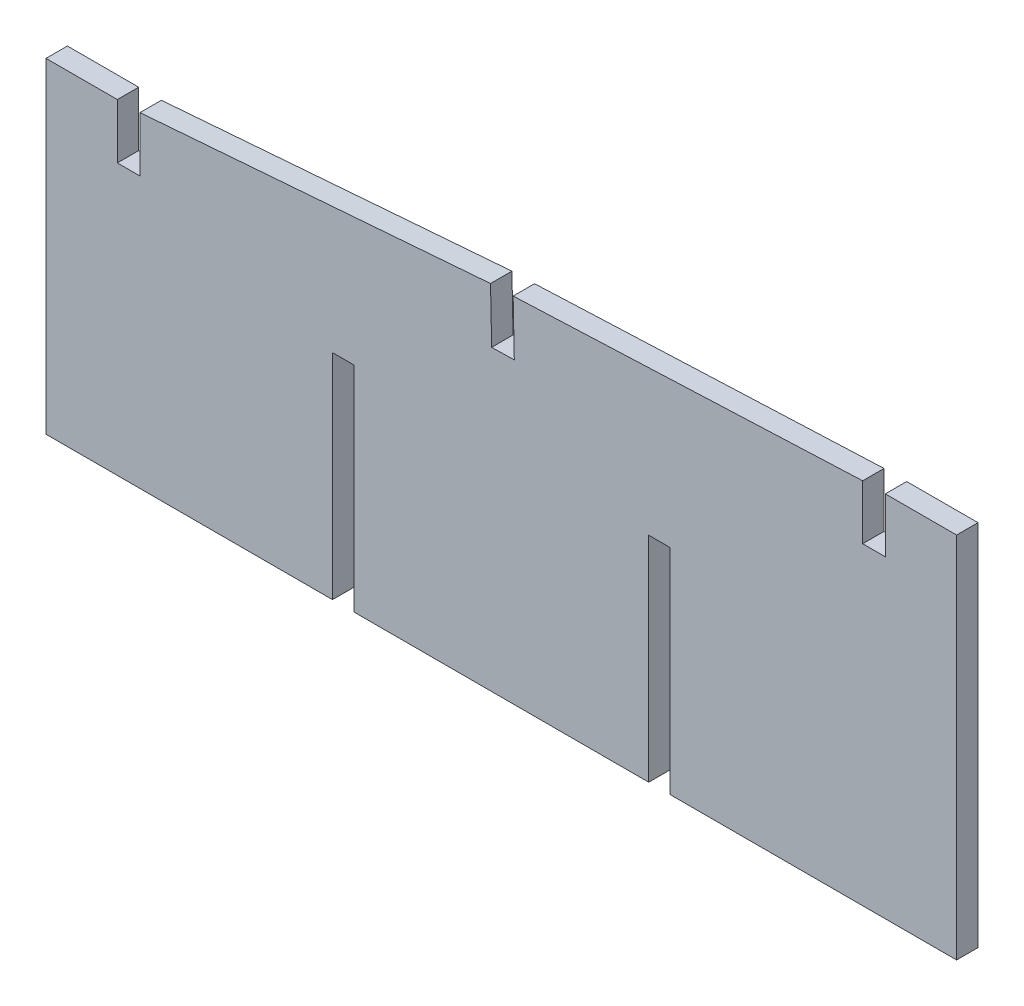
ISO-10303-21;
HEADER;
FILE_DESCRIPTION(('STEP AP214'),'2;1');
FILE_NAME('part.step','',(''),(''),'','','');
FILE_SCHEMA(('AUTOMOTIVE_DESIGN { 1 0 10303 214 1 1 1 1 }'));
ENDSEC;
DATA;
#1=APPLICATION_CONTEXT('core data for automotive mechanical design processes');
#2=APPLICATION_PROTOCOL_DEFINITION('international standard','automotive_design',2000,#1);
#3=PRODUCT_CONTEXT('',#1,'mechanical');
#4=PRODUCT('Part','Part','',(#3));
#5=PRODUCT_RELATED_PRODUCT_CATEGORY('part','',(#4));
#6=PRODUCT_DEFINITION_FORMATION('','',#4);
#7=PRODUCT_DEFINITION_CONTEXT('part definition',#1,'design');
#8=PRODUCT_DEFINITION('design','',#6,#7);
#9=PRODUCT_DEFINITION_SHAPE('','',#8);
#10=(LENGTH_UNIT() NAMED_UNIT(*) SI_UNIT(.MILLI.,.METRE.));
#11=(NAMED_UNIT(*) PLANE_ANGLE_UNIT() SI_UNIT($,.RADIAN.));
#12=(NAMED_UNIT(*) SI_UNIT($,.STERADIAN.) SOLID_ANGLE_UNIT());
#13=UNCERTAINTY_MEASURE_WITH_UNIT(LENGTH_MEASURE(1.E-05),#10,'distance_accuracy_value','');
#14=(GEOMETRIC_REPRESENTATION_CONTEXT(3) GLOBAL_UNCERTAINTY_ASSIGNED_CONTEXT((#13)) GLOBAL_UNIT_ASSIGNED_CONTEXT((#10,
#11,#12)) REPRESENTATION_CONTEXT('',''));
#15=CARTESIAN_POINT('',(0.,0.,0.));
#16=DIRECTION('',(0.,0.,1.));
#17=DIRECTION('',(1.,0.,0.));
#18=AXIS2_PLACEMENT_3D('',#15,#16,#17);
#19=CARTESIAN_POINT('',(374.396000000001,60.4052755232168,-423.));
#20=DIRECTION('',(-1.,0.,0.));
#21=DIRECTION('',(0.,0.,1.));
#22=AXIS2_PLACEMENT_3D('',#19,#20,#21);
#23=PLANE('',#22);
#24=DIRECTION('',(0.,-1.,0.));
#25=VECTOR('',#24,1.);
#26=CARTESIAN_POINT('',(374.396000000001,60.4052755232168,-420.));
#27=LINE('',#26,#25);
#28=CARTESIAN_POINT('',(374.396000000001,68.0484523892603,-420.));
#29=VERTEX_POINT('',#28);
#30=CARTESIAN_POINT('',(374.396000000001,60.4052755232168,-420.));
#31=VERTEX_POINT('',#30);
#32=EDGE_CURVE('E226',#29,#31,#27,.T.);
#33=ORIENTED_EDGE('',*,*,#32,.F.);
#34=DIRECTION('',(0.,0.,1.));
#35=VECTOR('',#34,1.);
#36=CARTESIAN_POINT('',(374.396000000001,68.0484523892603,-423.));
#37=LINE('',#36,#35);
#38=CARTESIAN_POINT('',(374.396000000001,68.0484523892603,-423.));
#39=VERTEX_POINT('',#38);
#40=EDGE_CURVE('E11',#39,#29,#37,.T.);
#41=ORIENTED_EDGE('',*,*,#40,.F.);
#42=DIRECTION('',(0.,-1.,0.));
#43=VECTOR('',#42,1.);
#44=CARTESIAN_POINT('',(374.396000000001,60.4052755232168,-423.));
#45=LINE('',#44,#43);
#46=CARTESIAN_POINT('',(374.396000000001,60.4052755232168,-423.));
#47=VERTEX_POINT('',#46);
#48=EDGE_CURVE('E294',#39,#47,#45,.T.);
#49=ORIENTED_EDGE('',*,*,#48,.T.);
#50=DIRECTION('',(0.,0.,1.));
#51=VECTOR('',#50,1.);
#52=CARTESIAN_POINT('',(374.396000000001,60.4052755232168,-423.));
#53=LINE('',#52,#51);
#54=EDGE_CURVE('E36',#47,#31,#53,.T.);
#55=ORIENTED_EDGE('',*,*,#54,.T.);
#56=EDGE_LOOP('',(#33,#41,#49,#55));
#57=FACE_BOUND('',#56,.T.);
#58=ADVANCED_FACE('F33',(#57),#23,.T.);
#59=CARTESIAN_POINT('',(384.396000000001,68.0484523892603,-423.));
#60=DIRECTION('',(0.,1.,0.));
#61=DIRECTION('',(-1.,0.,0.));
#62=AXIS2_PLACEMENT_3D('',#59,#60,#61);
#63=PLANE('',#62);
#64=DIRECTION('',(-1.,0.,0.));
#65=VECTOR('',#64,1.);
#66=CARTESIAN_POINT('',(384.396000000001,68.0484523892603,-420.));
#67=LINE('',#66,#65);
#68=CARTESIAN_POINT('',(384.396000000001,68.0484523892603,-420.));
#69=VERTEX_POINT('',#68);
#70=EDGE_CURVE('E292',#69,#29,#67,.T.);
#71=ORIENTED_EDGE('',*,*,#70,.F.);
#72=DIRECTION('',(0.,0.,1.));
#73=VECTOR('',#72,1.);
#74=CARTESIAN_POINT('',(384.396000000001,68.0484523892603,-423.));
#75=LINE('',#74,#73);
#76=CARTESIAN_POINT('',(384.396000000001,68.0484523892603,-423.));
#77=VERTEX_POINT('',#76);
#78=EDGE_CURVE('E42',#77,#69,#75,.T.);
#79=ORIENTED_EDGE('',*,*,#78,.F.);
#80=DIRECTION('',(-1.,0.,0.));
#81=VECTOR('',#80,1.);
#82=CARTESIAN_POINT('',(384.396000000001,68.0484523892603,-423.));
#83=LINE('',#82,#81);
#84=EDGE_CURVE('E216',#77,#39,#83,.T.);
#85=ORIENTED_EDGE('',*,*,#84,.T.);
#86=ORIENTED_EDGE('',*,*,#40,.T.);
#87=EDGE_LOOP('',(#71,#79,#85,#86));
#88=FACE_BOUND('',#87,.T.);
#89=ADVANCED_FACE('F338',(#88),#63,.T.);
#90=CARTESIAN_POINT('',(384.396000000001,16.4388254453726,-423.));
#91=DIRECTION('',(1.,0.,0.));
#92=DIRECTION('',(0.,0.,-1.));
#93=AXIS2_PLACEMENT_3D('',#90,#91,#92);
#94=PLANE('',#93);
#95=DIRECTION('',(0.,1.,0.));
#96=VECTOR('',#95,1.);
#97=CARTESIAN_POINT('',(384.396000000001,16.4388254453726,-420.));
#98=LINE('',#97,#96);
#99=CARTESIAN_POINT('',(384.396000000001,16.4388254453726,-420.));
#100=VERTEX_POINT('',#99);
#101=EDGE_CURVE('E203',#100,#69,#98,.T.);
#102=ORIENTED_EDGE('',*,*,#101,.F.);
#103=DIRECTION('',(0.,0.,1.));
#104=VECTOR('',#103,1.);
#105=CARTESIAN_POINT('',(384.396000000001,16.4388254453726,-423.));
#106=LINE('',#105,#104);
#107=CARTESIAN_POINT('',(384.396000000001,16.4388254453726,-423.));
#108=VERTEX_POINT('',#107);
#109=EDGE_CURVE('E198',#108,#100,#106,.T.);
#110=ORIENTED_EDGE('',*,*,#109,.F.);
#111=DIRECTION('',(0.,1.,0.));
#112=VECTOR('',#111,1.);
#113=CARTESIAN_POINT('',(384.396000000001,16.4388254453726,-423.));
#114=LINE('',#113,#112);
#115=EDGE_CURVE('E201',#108,#77,#114,.T.);
#116=ORIENTED_EDGE('',*,*,#115,.T.);
#117=ORIENTED_EDGE('',*,*,#78,.T.);
#118=EDGE_LOOP('',(#102,#110,#116,#117));
#119=FACE_BOUND('',#118,.T.);
#120=ADVANCED_FACE('F200',(#119),#94,.T.);
#121=CARTESIAN_POINT('',(344.221,16.4388254453726,-423.));
#122=DIRECTION('',(0.,-1.,0.));
#123=DIRECTION('',(1.,0.,0.));
#124=AXIS2_PLACEMENT_3D('',#121,#122,#123);
#125=PLANE('',#124);
#126=DIRECTION('',(1.,0.,0.));
#127=VECTOR('',#126,1.);
#128=CARTESIAN_POINT('',(344.221,16.4388254453726,-420.));
#129=LINE('',#128,#127);
#130=CARTESIAN_POINT('',(344.221,16.4388254453726,-420.));
#131=VERTEX_POINT('',#130);
#132=EDGE_CURVE('E289',#131,#100,#129,.T.);
#133=ORIENTED_EDGE('',*,*,#132,.F.);
#134=DIRECTION('',(0.,0.,1.));
#135=VECTOR('',#134,1.);
#136=CARTESIAN_POINT('',(344.221,16.4388254453726,-423.));
#137=LINE('',#136,#135);
#138=CARTESIAN_POINT('',(344.221,16.4388254453726,-423.));
#139=VERTEX_POINT('',#138);
#140=EDGE_CURVE('E208',#139,#131,#137,.T.);
#141=ORIENTED_EDGE('',*,*,#140,.F.);
#142=DIRECTION('',(1.,0.,0.));
#143=VECTOR('',#142,1.);
#144=CARTESIAN_POINT('',(344.221,16.4388254453726,-423.));
#145=LINE('',#144,#143);
#146=EDGE_CURVE('E214',#139,#108,#145,.T.);
#147=ORIENTED_EDGE('',*,*,#146,.T.);
#148=ORIENTED_EDGE('',*,*,#109,.T.);
#149=EDGE_LOOP('',(#133,#141,#147,#148));
#150=FACE_BOUND('',#149,.T.);
#151=ADVANCED_FACE('F218',(#150),#125,.T.);
#152=CARTESIAN_POINT('',(344.221,46.4388254453726,-423.));
#153=DIRECTION('',(-1.,0.,0.));
#154=DIRECTION('',(0.,0.,1.));
#155=AXIS2_PLACEMENT_3D('',#152,#153,#154);
#156=PLANE('',#155);
#157=DIRECTION('',(0.,-1.,0.));
#158=VECTOR('',#157,1.);
#159=CARTESIAN_POINT('',(344.221,46.4388254453726,-420.));
#160=LINE('',#159,#158);
#161=CARTESIAN_POINT('',(344.221,46.4388254453726,-420.));
#162=VERTEX_POINT('',#161);
#163=EDGE_CURVE('E286',#162,#131,#160,.T.);
#164=ORIENTED_EDGE('',*,*,#163,.F.);
#165=DIRECTION('',(0.,0.,1.));
#166=VECTOR('',#165,1.);
#167=CARTESIAN_POINT('',(344.221,46.4388254453726,-423.));
#168=LINE('',#167,#166);
#169=CARTESIAN_POINT('',(344.221,46.4388254453726,-423.));
#170=VERTEX_POINT('',#169);
#171=EDGE_CURVE('E298',#170,#162,#168,.T.);
#172=ORIENTED_EDGE('',*,*,#171,.F.);
#173=DIRECTION('',(0.,-1.,0.));
#174=VECTOR('',#173,1.);
#175=CARTESIAN_POINT('',(344.221,46.4388254453726,-423.));
#176=LINE('',#175,#174);
#177=EDGE_CURVE('E219',#170,#139,#176,.T.);
#178=ORIENTED_EDGE('',*,*,#177,.T.);
#179=ORIENTED_EDGE('',*,*,#140,.T.);
#180=EDGE_LOOP('',(#164,#172,#178,#179));
#181=FACE_BOUND('',#180,.T.);
#182=ADVANCED_FACE('F351',(#181),#156,.T.);
#183=CARTESIAN_POINT('',(341.221,46.4388254453726,-423.));
#184=DIRECTION('',(0.,-1.,0.));
#185=DIRECTION('',(0.,0.,-1.));
#186=AXIS2_PLACEMENT_3D('',#183,#184,#185);
#187=PLANE('',#186);
#188=DIRECTION('',(1.,0.,0.));
#189=VECTOR('',#188,1.);
#190=CARTESIAN_POINT('',(341.221,46.4388254453726,-420.));
#191=LINE('',#190,#189);
#192=CARTESIAN_POINT('',(341.221,46.4388254453726,-420.));
#193=VERTEX_POINT('',#192);
#194=EDGE_CURVE('E283',#193,#162,#191,.T.);
#195=ORIENTED_EDGE('',*,*,#194,.F.);
#196=DIRECTION('',(0.,0.,1.));
#197=VECTOR('',#196,1.);
#198=CARTESIAN_POINT('',(341.221,46.4388254453726,-423.));
#199=LINE('',#198,#197);
#200=CARTESIAN_POINT('',(341.221,46.4388254453726,-423.));
#201=VERTEX_POINT('',#200);
#202=EDGE_CURVE('E300',#201,#193,#199,.T.);
#203=ORIENTED_EDGE('',*,*,#202,.F.);
#204=DIRECTION('',(1.,0.,0.));
#205=VECTOR('',#204,1.);
#206=CARTESIAN_POINT('',(341.221,46.4388254453726,-423.));
#207=LINE('',#206,#205);
#208=EDGE_CURVE('E221',#201,#170,#207,.T.);
#209=ORIENTED_EDGE('',*,*,#208,.T.);
#210=ORIENTED_EDGE('',*,*,#171,.T.);
#211=EDGE_LOOP('',(#195,#203,#209,#210));
#212=FACE_BOUND('',#211,.T.);
#213=ADVANCED_FACE('F354',(#212),#187,.T.);
#214=CARTESIAN_POINT('',(341.221,16.4388254453726,-423.));
#215=DIRECTION('',(1.,0.,0.));
#216=DIRECTION('',(0.,0.,-1.));
#217=AXIS2_PLACEMENT_3D('',#214,#215,#216);
#218=PLANE('',#217);
#219=DIRECTION('',(0.,1.,0.));
#220=VECTOR('',#219,1.);
#221=CARTESIAN_POINT('',(341.221,16.4388254453726,-420.));
#222=LINE('',#221,#220);
#223=CARTESIAN_POINT('',(341.221,16.4388254453726,-420.));
#224=VERTEX_POINT('',#223);
#225=EDGE_CURVE('E280',#224,#193,#222,.T.);
#226=ORIENTED_EDGE('',*,*,#225,.F.);
#227=DIRECTION('',(0.,0.,1.));
#228=VECTOR('',#227,1.);
#229=CARTESIAN_POINT('',(341.221,16.4388254453726,-423.));
#230=LINE('',#229,#228);
#231=CARTESIAN_POINT('',(341.221,16.4388254453726,-423.));
#232=VERTEX_POINT('',#231);
#233=EDGE_CURVE('E302',#232,#224,#230,.T.);
#234=ORIENTED_EDGE('',*,*,#233,.F.);
#235=DIRECTION('',(0.,1.,0.));
#236=VECTOR('',#235,1.);
#237=CARTESIAN_POINT('',(341.221,16.4388254453726,-423.));
#238=LINE('',#237,#236);
#239=EDGE_CURVE('E644',#232,#201,#238,.T.);
#240=ORIENTED_EDGE('',*,*,#239,.T.);
#241=ORIENTED_EDGE('',*,*,#202,.T.);
#242=EDGE_LOOP('',(#226,#234,#240,#241));
#243=FACE_BOUND('',#242,.T.);
#244=ADVANCED_FACE('F358',(#243),#218,.T.);
#245=CARTESIAN_POINT('',(299.875,16.4388254453726,-423.));
#246=DIRECTION('',(0.,-1.,0.));
#247=DIRECTION('',(1.,0.,0.));
#248=AXIS2_PLACEMENT_3D('',#245,#246,#247);
#249=PLANE('',#248);
#250=DIRECTION('',(1.,0.,0.));
#251=VECTOR('',#250,1.);
#252=CARTESIAN_POINT('',(299.875,16.4388254453726,-420.));
#253=LINE('',#252,#251);
#254=CARTESIAN_POINT('',(299.875,16.4388254453726,-420.));
#255=VERTEX_POINT('',#254);
#256=EDGE_CURVE('E277',#255,#224,#253,.T.);
#257=ORIENTED_EDGE('',*,*,#256,.F.);
#258=DIRECTION('',(0.,0.,1.));
#259=VECTOR('',#258,1.);
#260=CARTESIAN_POINT('',(299.875,16.4388254453726,-423.));
#261=LINE('',#260,#259);
#262=CARTESIAN_POINT('',(299.875,16.4388254453726,-423.));
#263=VERTEX_POINT('',#262);
#264=EDGE_CURVE('E304',#263,#255,#261,.T.);
#265=ORIENTED_EDGE('',*,*,#264,.F.);
#266=DIRECTION('',(1.,0.,0.));
#267=VECTOR('',#266,1.);
#268=CARTESIAN_POINT('',(299.875,16.4388254453726,-423.));
#269=LINE('',#268,#267);
#270=EDGE_CURVE('E648',#263,#232,#269,.T.);
#271=ORIENTED_EDGE('',*,*,#270,.T.);
#272=ORIENTED_EDGE('',*,*,#233,.T.);
#273=EDGE_LOOP('',(#257,#265,#271,#272));
#274=FACE_BOUND('',#273,.T.);
#275=ADVANCED_FACE('F362',(#274),#249,.T.);
#276=CARTESIAN_POINT('',(299.875,46.4388254453726,-423.));
#277=DIRECTION('',(-1.,0.,0.));
#278=DIRECTION('',(0.,0.,1.));
#279=AXIS2_PLACEMENT_3D('',#276,#277,#278);
#280=PLANE('',#279);
#281=DIRECTION('',(0.,-1.,0.));
#282=VECTOR('',#281,1.);
#283=CARTESIAN_POINT('',(299.875,46.4388254453726,-420.));
#284=LINE('',#283,#282);
#285=CARTESIAN_POINT('',(299.875,46.4388254453726,-420.));
#286=VERTEX_POINT('',#285);
#287=EDGE_CURVE('E274',#286,#255,#284,.T.);
#288=ORIENTED_EDGE('',*,*,#287,.F.);
#289=DIRECTION('',(0.,0.,1.));
#290=VECTOR('',#289,1.);
#291=CARTESIAN_POINT('',(299.875,46.4388254453726,-423.));
#292=LINE('',#291,#290);
#293=CARTESIAN_POINT('',(299.875,46.4388254453726,-423.));
#294=VERTEX_POINT('',#293);
#295=EDGE_CURVE('E306',#294,#286,#292,.T.);
#296=ORIENTED_EDGE('',*,*,#295,.F.);
#297=DIRECTION('',(0.,-1.,0.));
#298=VECTOR('',#297,1.);
#299=CARTESIAN_POINT('',(299.875,46.4388254453726,-423.));
#300=LINE('',#299,#298);
#301=EDGE_CURVE('E637',#294,#263,#300,.T.);
#302=ORIENTED_EDGE('',*,*,#301,.T.);
#303=ORIENTED_EDGE('',*,*,#264,.T.);
#304=EDGE_LOOP('',(#288,#296,#302,#303));
#305=FACE_BOUND('',#304,.T.);
#306=ADVANCED_FACE('F366',(#305),#280,.T.);
#307=CARTESIAN_POINT('',(296.875,46.4388254453726,-423.));
#308=DIRECTION('',(0.,-1.,0.));
#309=DIRECTION('',(0.,0.,-1.));
#310=AXIS2_PLACEMENT_3D('',#307,#308,#309);
#311=PLANE('',#310);
#312=DIRECTION('',(1.,0.,0.));
#313=VECTOR('',#312,1.);
#314=CARTESIAN_POINT('',(296.875,46.4388254453726,-420.));
#315=LINE('',#314,#313);
#316=CARTESIAN_POINT('',(296.875,46.4388254453726,-420.));
#317=VERTEX_POINT('',#316);
#318=EDGE_CURVE('E271',#317,#286,#315,.T.);
#319=ORIENTED_EDGE('',*,*,#318,.F.);
#320=DIRECTION('',(0.,0.,1.));
#321=VECTOR('',#320,1.);
#322=CARTESIAN_POINT('',(296.875,46.4388254453726,-423.));
#323=LINE('',#322,#321);
#324=CARTESIAN_POINT('',(296.875,46.4388254453726,-423.));
#325=VERTEX_POINT('',#324);
#326=EDGE_CURVE('E308',#325,#317,#323,.T.);
#327=ORIENTED_EDGE('',*,*,#326,.F.);
#328=DIRECTION('',(1.,0.,0.));
#329=VECTOR('',#328,1.);
#330=CARTESIAN_POINT('',(296.875,46.4388254453726,-423.));
#331=LINE('',#330,#329);
#332=EDGE_CURVE('E633',#325,#294,#331,.T.);
#333=ORIENTED_EDGE('',*,*,#332,.T.);
#334=ORIENTED_EDGE('',*,*,#295,.T.);
#335=EDGE_LOOP('',(#319,#327,#333,#334));
#336=FACE_BOUND('',#335,.T.);
#337=ADVANCED_FACE('F370',(#336),#311,.T.);
#338=CARTESIAN_POINT('',(296.875,16.4388254453726,-423.));
#339=DIRECTION('',(1.,0.,0.));
#340=DIRECTION('',(0.,0.,-1.));
#341=AXIS2_PLACEMENT_3D('',#338,#339,#340);
#342=PLANE('',#341);
#343=DIRECTION('',(0.,1.,0.));
#344=VECTOR('',#343,1.);
#345=CARTESIAN_POINT('',(296.875,16.4388254453726,-420.));
#346=LINE('',#345,#344);
#347=CARTESIAN_POINT('',(296.875,16.4388254453726,-420.));
#348=VERTEX_POINT('',#347);
#349=EDGE_CURVE('E268',#348,#317,#346,.T.);
#350=ORIENTED_EDGE('',*,*,#349,.F.);
#351=DIRECTION('',(0.,0.,1.));
#352=VECTOR('',#351,1.);
#353=CARTESIAN_POINT('',(296.875,16.4388254453726,-423.));
#354=LINE('',#353,#352);
#355=CARTESIAN_POINT('',(296.875,16.4388254453726,-423.));
#356=VERTEX_POINT('',#355);
#357=EDGE_CURVE('E310',#356,#348,#354,.T.);
#358=ORIENTED_EDGE('',*,*,#357,.F.);
#359=DIRECTION('',(0.,1.,0.));
#360=VECTOR('',#359,1.);
#361=CARTESIAN_POINT('',(296.875,16.4388254453726,-423.));
#362=LINE('',#361,#360);
#363=EDGE_CURVE('E654',#356,#325,#362,.T.);
#364=ORIENTED_EDGE('',*,*,#363,.T.);
#365=ORIENTED_EDGE('',*,*,#326,.T.);
#366=EDGE_LOOP('',(#350,#358,#364,#365));
#367=FACE_BOUND('',#366,.T.);
#368=ADVANCED_FACE('F374',(#367),#342,.T.);
#369=CARTESIAN_POINT('',(256.7,16.4388254453726,-423.));
#370=DIRECTION('',(0.,-1.,0.));
#371=DIRECTION('',(1.,0.,0.));
#372=AXIS2_PLACEMENT_3D('',#369,#370,#371);
#373=PLANE('',#372);
#374=DIRECTION('',(1.,0.,0.));
#375=VECTOR('',#374,1.);
#376=CARTESIAN_POINT('',(256.7,16.4388254453726,-420.));
#377=LINE('',#376,#375);
#378=CARTESIAN_POINT('',(256.7,16.4388254453726,-420.));
#379=VERTEX_POINT('',#378);
#380=EDGE_CURVE('E265',#379,#348,#377,.T.);
#381=ORIENTED_EDGE('',*,*,#380,.F.);
#382=DIRECTION('',(0.,0.,1.));
#383=VECTOR('',#382,1.);
#384=CARTESIAN_POINT('',(256.7,16.4388254453726,-423.));
#385=LINE('',#384,#383);
#386=CARTESIAN_POINT('',(256.7,16.4388254453726,-423.));
#387=VERTEX_POINT('',#386);
#388=EDGE_CURVE('E312',#387,#379,#385,.T.);
#389=ORIENTED_EDGE('',*,*,#388,.F.);
#390=DIRECTION('',(1.,0.,0.));
#391=VECTOR('',#390,1.);
#392=CARTESIAN_POINT('',(256.7,16.4388254453726,-423.));
#393=LINE('',#392,#391);
#394=EDGE_CURVE('E626',#387,#356,#393,.T.);
#395=ORIENTED_EDGE('',*,*,#394,.T.);
#396=ORIENTED_EDGE('',*,*,#357,.T.);
#397=EDGE_LOOP('',(#381,#389,#395,#396));
#398=FACE_BOUND('',#397,.T.);
#399=ADVANCED_FACE('F378',(#398),#373,.T.);
#400=CARTESIAN_POINT('',(256.7,62.0886348852188,-423.));
#401=DIRECTION('',(-1.,0.,0.));
#402=DIRECTION('',(0.,0.,1.));
#403=AXIS2_PLACEMENT_3D('',#400,#401,#402);
#404=PLANE('',#403);
#405=DIRECTION('',(0.,-1.,0.));
#406=VECTOR('',#405,1.);
#407=CARTESIAN_POINT('',(256.7,62.0886348852188,-420.));
#408=LINE('',#407,#406);
#409=CARTESIAN_POINT('',(256.7,62.0886348852188,-420.));
#410=VERTEX_POINT('',#409);
#411=EDGE_CURVE('E262',#410,#379,#408,.T.);
#412=ORIENTED_EDGE('',*,*,#411,.F.);
#413=DIRECTION('',(0.,0.,1.));
#414=VECTOR('',#413,1.);
#415=CARTESIAN_POINT('',(256.7,62.0886348852188,-423.));
#416=LINE('',#415,#414);
#417=CARTESIAN_POINT('',(256.7,62.0886348852188,-423.));
#418=VERTEX_POINT('',#417);
#419=EDGE_CURVE('E314',#418,#410,#416,.T.);
#420=ORIENTED_EDGE('',*,*,#419,.F.);
#421=DIRECTION('',(0.,-1.,0.));
#422=VECTOR('',#421,1.);
#423=CARTESIAN_POINT('',(256.7,62.0886348852188,-423.));
#424=LINE('',#423,#422);
#425=EDGE_CURVE('E622',#418,#387,#424,.T.);
#426=ORIENTED_EDGE('',*,*,#425,.T.);
#427=ORIENTED_EDGE('',*,*,#388,.T.);
#428=EDGE_LOOP('',(#412,#420,#426,#427));
#429=FACE_BOUND('',#428,.T.);
#430=ADVANCED_FACE('F382',(#429),#404,.T.);
#431=CARTESIAN_POINT('',(266.7,62.0886348852188,-423.));
#432=DIRECTION('',(0.,1.,0.));
#433=DIRECTION('',(-1.,0.,0.));
#434=AXIS2_PLACEMENT_3D('',#431,#432,#433);
#435=PLANE('',#434);
#436=DIRECTION('',(-1.,0.,0.));
#437=VECTOR('',#436,1.);
#438=CARTESIAN_POINT('',(266.7,62.0886348852188,-420.));
#439=LINE('',#438,#437);
#440=CARTESIAN_POINT('',(266.7,62.0886348852188,-420.));
#441=VERTEX_POINT('',#440);
#442=EDGE_CURVE('E259',#441,#410,#439,.T.);
#443=ORIENTED_EDGE('',*,*,#442,.F.);
#444=DIRECTION('',(0.,0.,1.));
#445=VECTOR('',#444,1.);
#446=CARTESIAN_POINT('',(266.7,62.0886348852188,-423.));
#447=LINE('',#446,#445);
#448=CARTESIAN_POINT('',(266.7,62.0886348852188,-423.));
#449=VERTEX_POINT('',#448);
#450=EDGE_CURVE('E316',#449,#441,#447,.T.);
#451=ORIENTED_EDGE('',*,*,#450,.F.);
#452=DIRECTION('',(-1.,0.,0.));
#453=VECTOR('',#452,1.);
#454=CARTESIAN_POINT('',(266.7,62.0886348852188,-423.));
#455=LINE('',#454,#453);
#456=EDGE_CURVE('E658',#449,#418,#455,.T.);
#457=ORIENTED_EDGE('',*,*,#456,.T.);
#458=ORIENTED_EDGE('',*,*,#419,.T.);
#459=EDGE_LOOP('',(#443,#451,#457,#458));
#460=FACE_BOUND('',#459,.T.);
#461=ADVANCED_FACE('F386',(#460),#435,.T.);
#462=CARTESIAN_POINT('',(266.7,62.0886348852188,-423.));
#463=DIRECTION('',(1.,0.,0.));
#464=DIRECTION('',(0.,1.,0.));
#465=AXIS2_PLACEMENT_3D('',#462,#463,#464);
#466=PLANE('',#465);
#467=DIRECTION('',(0.,1.,0.));
#468=VECTOR('',#467,1.);
#469=CARTESIAN_POINT('',(266.7,62.0886348852188,-420.));
#470=LINE('',#469,#468);
#471=CARTESIAN_POINT('',(266.7,54.3898094347038,-420.));
#472=VERTEX_POINT('',#471);
#473=EDGE_CURVE('E256',#472,#441,#470,.T.);
#474=ORIENTED_EDGE('',*,*,#473,.F.);
#475=DIRECTION('',(0.,0.,1.));
#476=VECTOR('',#475,1.);
#477=CARTESIAN_POINT('',(266.7,54.3898094347038,-423.));
#478=LINE('',#477,#476);
#479=CARTESIAN_POINT('',(266.7,54.3898094347038,-423.));
#480=VERTEX_POINT('',#479);
#481=EDGE_CURVE('E318',#480,#472,#478,.T.);
#482=ORIENTED_EDGE('',*,*,#481,.F.);
#483=DIRECTION('',(0.,1.,0.));
#484=VECTOR('',#483,1.);
#485=CARTESIAN_POINT('',(266.7,62.0886348852188,-423.));
#486=LINE('',#485,#484);
#487=EDGE_CURVE('E615',#480,#449,#486,.T.);
#488=ORIENTED_EDGE('',*,*,#487,.T.);
#489=ORIENTED_EDGE('',*,*,#450,.T.);
#490=EDGE_LOOP('',(#474,#482,#488,#489));
#491=FACE_BOUND('',#490,.T.);
#492=ADVANCED_FACE('F390',(#491),#466,.T.);
#493=CARTESIAN_POINT('',(266.7,54.3898094347038,-423.));
#494=DIRECTION('',(0.,1.,0.));
#495=DIRECTION('',(0.,0.,1.));
#496=AXIS2_PLACEMENT_3D('',#493,#494,#495);
#497=PLANE('',#496);
#498=DIRECTION('',(-1.,0.,0.));
#499=VECTOR('',#498,1.);
#500=CARTESIAN_POINT('',(266.7,54.3898094347038,-420.));
#501=LINE('',#500,#499);
#502=CARTESIAN_POINT('',(269.875,54.3898094347038,-420.));
#503=VERTEX_POINT('',#502);
#504=EDGE_CURVE('E253',#503,#472,#501,.T.);
#505=ORIENTED_EDGE('',*,*,#504,.F.);
#506=DIRECTION('',(0.,0.,1.));
#507=VECTOR('',#506,1.);
#508=CARTESIAN_POINT('',(269.875,54.3898094347038,-423.));
#509=LINE('',#508,#507);
#510=CARTESIAN_POINT('',(269.875,54.3898094347038,-423.));
#511=VERTEX_POINT('',#510);
#512=EDGE_CURVE('E320',#511,#503,#509,.T.);
#513=ORIENTED_EDGE('',*,*,#512,.F.);
#514=DIRECTION('',(-1.,0.,0.));
#515=VECTOR('',#514,1.);
#516=CARTESIAN_POINT('',(266.7,54.3898094347038,-423.));
#517=LINE('',#516,#515);
#518=EDGE_CURVE('E611',#511,#480,#517,.T.);
#519=ORIENTED_EDGE('',*,*,#518,.T.);
#520=ORIENTED_EDGE('',*,*,#481,.T.);
#521=EDGE_LOOP('',(#505,#513,#519,#520));
#522=FACE_BOUND('',#521,.T.);
#523=ADVANCED_FACE('F394',(#522),#497,.T.);
#524=CARTESIAN_POINT('',(269.875,62.0886341601574,-423.));
#525=DIRECTION('',(-1.,0.,0.));
#526=DIRECTION('',(0.,0.,1.));
#527=AXIS2_PLACEMENT_3D('',#524,#525,#526);
#528=PLANE('',#527);
#529=DIRECTION('',(0.,-1.,0.));
#530=VECTOR('',#529,1.);
#531=CARTESIAN_POINT('',(269.875,62.0886341601574,-420.));
#532=LINE('',#531,#530);
#533=CARTESIAN_POINT('',(269.875,62.0886341601574,-420.));
#534=VERTEX_POINT('',#533);
#535=EDGE_CURVE('E250',#534,#503,#532,.T.);
#536=ORIENTED_EDGE('',*,*,#535,.F.);
#537=DIRECTION('',(0.,0.,1.));
#538=VECTOR('',#537,1.);
#539=CARTESIAN_POINT('',(269.875,62.0886341601574,-423.));
#540=LINE('',#539,#538);
#541=CARTESIAN_POINT('',(269.875,62.0886341601574,-423.));
#542=VERTEX_POINT('',#541);
#543=EDGE_CURVE('E322',#542,#534,#540,.T.);
#544=ORIENTED_EDGE('',*,*,#543,.F.);
#545=DIRECTION('',(0.,-1.,0.));
#546=VECTOR('',#545,1.);
#547=CARTESIAN_POINT('',(269.875,62.0886341601574,-423.));
#548=LINE('',#547,#546);
#549=EDGE_CURVE('E662',#542,#511,#548,.T.);
#550=ORIENTED_EDGE('',*,*,#549,.T.);
#551=ORIENTED_EDGE('',*,*,#512,.T.);
#552=EDGE_LOOP('',(#536,#544,#550,#551));
#553=FACE_BOUND('',#552,.T.);
#554=ADVANCED_FACE('F398',(#553),#528,.T.);
#555=CARTESIAN_POINT('',(319.035485474159,65.9145009944278,-423.));
#556=DIRECTION('',(-0.0775894161566666,0.996985397335622,0.));
#557=DIRECTION('',(-0.996985397335622,-0.0775894161566666,0.));
#558=AXIS2_PLACEMENT_3D('',#555,#556,#557);
#559=PLANE('',#558);
#560=DIRECTION('',(-0.996985397335622,-0.0775894161566666,0.));
#561=VECTOR('',#560,1.);
#562=CARTESIAN_POINT('',(319.035485474159,65.9145009944278,-420.));
#563=LINE('',#562,#561);
#564=CARTESIAN_POINT('',(319.035485474159,65.9145009944278,-420.));
#565=VERTEX_POINT('',#564);
#566=EDGE_CURVE('E247',#565,#534,#563,.T.);
#567=ORIENTED_EDGE('',*,*,#566,.F.);
#568=DIRECTION('',(0.,0.,1.));
#569=VECTOR('',#568,1.);
#570=CARTESIAN_POINT('',(319.035485474159,65.9145009944278,-423.));
#571=LINE('',#570,#569);
#572=CARTESIAN_POINT('',(319.035485474159,65.9145009944278,-423.));
#573=VERTEX_POINT('',#572);
#574=EDGE_CURVE('E324',#573,#565,#571,.T.);
#575=ORIENTED_EDGE('',*,*,#574,.F.);
#576=DIRECTION('',(-0.996985397335622,-0.0775894161566666,0.));
#577=VECTOR('',#576,1.);
#578=CARTESIAN_POINT('',(319.035485474159,65.9145009944278,-423.));
#579=LINE('',#578,#577);
#580=EDGE_CURVE('E604',#573,#542,#579,.T.);
#581=ORIENTED_EDGE('',*,*,#580,.T.);
#582=ORIENTED_EDGE('',*,*,#543,.T.);
#583=EDGE_LOOP('',(#567,#575,#581,#582));
#584=FACE_BOUND('',#583,.T.);
#585=ADVANCED_FACE('F402',(#584),#559,.T.);
#586=CARTESIAN_POINT('',(319.035485474159,65.9145009944278,-423.));
#587=DIRECTION('',(0.999785281478349,0.0207217503907983,0.));
#588=DIRECTION('',(-0.0207217503907983,0.999785281478349,0.));
#589=AXIS2_PLACEMENT_3D('',#586,#587,#588);
#590=PLANE('',#589);
#591=DIRECTION('',(-0.0207217503907983,0.999785281478349,0.));
#592=VECTOR('',#591,1.);
#593=CARTESIAN_POINT('',(319.035485474159,65.9145009944278,-420.));
#594=LINE('',#593,#592);
#595=CARTESIAN_POINT('',(319.194537443408,58.2405441690028,-420.));
#596=VERTEX_POINT('',#595);
#597=EDGE_CURVE('E244',#596,#565,#594,.T.);
#598=ORIENTED_EDGE('',*,*,#597,.F.);
#599=DIRECTION('',(0.,0.,1.));
#600=VECTOR('',#599,1.);
#601=CARTESIAN_POINT('',(319.194537443408,58.2405441690028,-423.));
#602=LINE('',#601,#600);
#603=CARTESIAN_POINT('',(319.194537443408,58.2405441690028,-423.));
#604=VERTEX_POINT('',#603);
#605=EDGE_CURVE('E326',#604,#596,#602,.T.);
#606=ORIENTED_EDGE('',*,*,#605,.F.);
#607=DIRECTION('',(-0.0207217503907983,0.999785281478349,0.));
#608=VECTOR('',#607,1.);
#609=CARTESIAN_POINT('',(319.035485474159,65.9145009944278,-423.));
#610=LINE('',#609,#608);
#611=EDGE_CURVE('E600',#604,#573,#610,.T.);
#612=ORIENTED_EDGE('',*,*,#611,.T.);
#613=ORIENTED_EDGE('',*,*,#574,.T.);
#614=EDGE_LOOP('',(#598,#606,#612,#613));
#615=FACE_BOUND('',#614,.T.);
#616=ADVANCED_FACE('F406',(#615),#590,.T.);
#617=CARTESIAN_POINT('',(319.194537443408,58.2405441690028,-423.));
#618=DIRECTION('',(-0.0206300635458126,0.999787177592359,0.));
#619=DIRECTION('',(-0.999787177592359,-0.0206300635458126,0.));
#620=AXIS2_PLACEMENT_3D('',#617,#618,#619);
#621=PLANE('',#620);
#622=DIRECTION('',(-0.999787177592359,-0.0206300635458126,0.));
#623=VECTOR('',#622,1.);
#624=CARTESIAN_POINT('',(319.194537443408,58.2405441690028,-420.));
#625=LINE('',#624,#623);
#626=CARTESIAN_POINT('',(322.368863108611,58.3060446491609,-420.));
#627=VERTEX_POINT('',#626);
#628=EDGE_CURVE('E241',#627,#596,#625,.T.);
#629=ORIENTED_EDGE('',*,*,#628,.F.);
#630=DIRECTION('',(0.,0.,1.));
#631=VECTOR('',#630,1.);
#632=CARTESIAN_POINT('',(322.368863108611,58.3060446491609,-423.));
#633=LINE('',#632,#631);
#634=CARTESIAN_POINT('',(322.368863108611,58.3060446491609,-423.));
#635=VERTEX_POINT('',#634);
#636=EDGE_CURVE('E328',#635,#627,#633,.T.);
#637=ORIENTED_EDGE('',*,*,#636,.F.);
#638=DIRECTION('',(-0.999787177592359,-0.0206300635458126,0.));
#639=VECTOR('',#638,1.);
#640=CARTESIAN_POINT('',(319.194537443408,58.2405441690028,-423.));
#641=LINE('',#640,#639);
#642=EDGE_CURVE('E666',#635,#604,#641,.T.);
#643=ORIENTED_EDGE('',*,*,#642,.T.);
#644=ORIENTED_EDGE('',*,*,#605,.T.);
#645=EDGE_LOOP('',(#629,#637,#643,#644));
#646=FACE_BOUND('',#645,.T.);
#647=ADVANCED_FACE('F410',(#646),#621,.T.);
#648=CARTESIAN_POINT('',(322.209811102402,65.9800032605013,-423.));
#649=DIRECTION('',(-0.9997852814785,-0.0207217503835021,0.));
#650=DIRECTION('',(0.0207217503835021,-0.9997852814785,0.));
#651=AXIS2_PLACEMENT_3D('',#648,#649,#650);
#652=PLANE('',#651);
#653=DIRECTION('',(0.0207217503835021,-0.9997852814785,0.));
#654=VECTOR('',#653,1.);
#655=CARTESIAN_POINT('',(322.209811102402,65.9800032605013,-420.));
#656=LINE('',#655,#654);
#657=CARTESIAN_POINT('',(322.209811102402,65.9800032605013,-420.));
#658=VERTEX_POINT('',#657);
#659=EDGE_CURVE('E238',#658,#627,#656,.T.);
#660=ORIENTED_EDGE('',*,*,#659,.F.);
#661=DIRECTION('',(0.,0.,1.));
#662=VECTOR('',#661,1.);
#663=CARTESIAN_POINT('',(322.209811102402,65.9800032605013,-423.));
#664=LINE('',#663,#662);
#665=CARTESIAN_POINT('',(322.209811102402,65.9800032605013,-423.));
#666=VERTEX_POINT('',#665);
#667=EDGE_CURVE('E330',#666,#658,#664,.T.);
#668=ORIENTED_EDGE('',*,*,#667,.F.);
#669=DIRECTION('',(0.0207217503835021,-0.9997852814785,0.));
#670=VECTOR('',#669,1.);
#671=CARTESIAN_POINT('',(322.209811102402,65.9800032605013,-423.));
#672=LINE('',#671,#670);
#673=EDGE_CURVE('E593',#666,#635,#672,.T.);
#674=ORIENTED_EDGE('',*,*,#673,.T.);
#675=ORIENTED_EDGE('',*,*,#636,.T.);
#676=EDGE_LOOP('',(#660,#668,#674,#675));
#677=FACE_BOUND('',#676,.T.);
#678=ADVANCED_FACE('F414',(#677),#652,.T.);
#679=CARTESIAN_POINT('',(371.221000000001,68.0484530845081,-423.));
#680=DIRECTION('',(-0.0421660894610839,0.999110614946893,0.));
#681=DIRECTION('',(-0.999110614946894,-0.0421660894610839,0.));
#682=AXIS2_PLACEMENT_3D('',#679,#680,#681);
#683=PLANE('',#682);
#684=DIRECTION('',(-0.999110614946894,-0.0421660894610839,0.));
#685=VECTOR('',#684,1.);
#686=CARTESIAN_POINT('',(371.221000000001,68.0484530845081,-420.));
#687=LINE('',#686,#685);
#688=CARTESIAN_POINT('',(371.221000000001,68.0484530845081,-420.));
#689=VERTEX_POINT('',#688);
#690=EDGE_CURVE('E235',#689,#658,#687,.T.);
#691=ORIENTED_EDGE('',*,*,#690,.F.);
#692=DIRECTION('',(0.,0.,1.));
#693=VECTOR('',#692,1.);
#694=CARTESIAN_POINT('',(371.221000000001,68.0484530845081,-423.));
#695=LINE('',#694,#693);
#696=CARTESIAN_POINT('',(371.221000000001,68.0484530845081,-423.));
#697=VERTEX_POINT('',#696);
#698=EDGE_CURVE('E332',#697,#689,#695,.T.);
#699=ORIENTED_EDGE('',*,*,#698,.F.);
#700=DIRECTION('',(-0.999110614946894,-0.0421660894610839,0.));
#701=VECTOR('',#700,1.);
#702=CARTESIAN_POINT('',(371.221000000001,68.0484530845081,-423.));
#703=LINE('',#702,#701);
#704=EDGE_CURVE('E589',#697,#666,#703,.T.);
#705=ORIENTED_EDGE('',*,*,#704,.T.);
#706=ORIENTED_EDGE('',*,*,#667,.T.);
#707=EDGE_LOOP('',(#691,#699,#705,#706));
#708=FACE_BOUND('',#707,.T.);
#709=ADVANCED_FACE('F418',(#708),#683,.T.);
#710=CARTESIAN_POINT('',(371.221000000001,60.4052755232168,-423.));
#711=DIRECTION('',(1.,0.,0.));
#712=DIRECTION('',(0.,0.,-1.));
#713=AXIS2_PLACEMENT_3D('',#710,#711,#712);
#714=PLANE('',#713);
#715=DIRECTION('',(0.,1.,0.));
#716=VECTOR('',#715,1.);
#717=CARTESIAN_POINT('',(371.221000000001,60.4052755232168,-420.));
#718=LINE('',#717,#716);
#719=CARTESIAN_POINT('',(371.221000000001,60.4052755232168,-420.));
#720=VERTEX_POINT('',#719);
#721=EDGE_CURVE('E232',#720,#689,#718,.T.);
#722=ORIENTED_EDGE('',*,*,#721,.F.);
#723=DIRECTION('',(0.,0.,1.));
#724=VECTOR('',#723,1.);
#725=CARTESIAN_POINT('',(371.221000000001,60.4052755232168,-423.));
#726=LINE('',#725,#724);
#727=CARTESIAN_POINT('',(371.221000000001,60.4052755232168,-423.));
#728=VERTEX_POINT('',#727);
#729=EDGE_CURVE('E333',#728,#720,#726,.T.);
#730=ORIENTED_EDGE('',*,*,#729,.F.);
#731=DIRECTION('',(0.,1.,0.));
#732=VECTOR('',#731,1.);
#733=CARTESIAN_POINT('',(371.221000000001,60.4052755232168,-423.));
#734=LINE('',#733,#732);
#735=EDGE_CURVE('E670',#728,#697,#734,.T.);
#736=ORIENTED_EDGE('',*,*,#735,.T.);
#737=ORIENTED_EDGE('',*,*,#698,.T.);
#738=EDGE_LOOP('',(#722,#730,#736,#737));
#739=FACE_BOUND('',#738,.T.);
#740=ADVANCED_FACE('F422',(#739),#714,.T.);
#741=CARTESIAN_POINT('',(371.221000000001,60.4052755232168,-423.));
#742=DIRECTION('',(0.,1.,0.));
#743=DIRECTION('',(0.,0.,1.));
#744=AXIS2_PLACEMENT_3D('',#741,#742,#743);
#745=PLANE('',#744);
#746=DIRECTION('',(-1.,0.,0.));
#747=VECTOR('',#746,1.);
#748=CARTESIAN_POINT('',(371.221000000001,60.4052755232168,-420.));
#749=LINE('',#748,#747);
#750=EDGE_CURVE('E229',#31,#720,#749,.T.);
#751=ORIENTED_EDGE('',*,*,#750,.F.);
#752=ORIENTED_EDGE('',*,*,#54,.F.);
#753=DIRECTION('',(-1.,0.,0.));
#754=VECTOR('',#753,1.);
#755=CARTESIAN_POINT('',(371.221000000001,60.4052755232168,-423.));
#756=LINE('',#755,#754);
#757=EDGE_CURVE('E672',#47,#728,#756,.T.);
#758=ORIENTED_EDGE('',*,*,#757,.T.);
#759=ORIENTED_EDGE('',*,*,#729,.T.);
#760=EDGE_LOOP('',(#751,#752,#758,#759));
#761=FACE_BOUND('',#760,.T.);
#762=ADVANCED_FACE('F335',(#761),#745,.T.);
#763=CARTESIAN_POINT('',(0.,0.,-423.));
#764=DIRECTION('',(0.,0.,1.));
#765=DIRECTION('',(1.,0.,0.));
#766=AXIS2_PLACEMENT_3D('',#763,#764,#765);
#767=PLANE('',#766);
#768=ORIENTED_EDGE('',*,*,#48,.F.);
#769=ORIENTED_EDGE('',*,*,#84,.F.);
#770=ORIENTED_EDGE('',*,*,#115,.F.);
#771=ORIENTED_EDGE('',*,*,#146,.F.);
#772=ORIENTED_EDGE('',*,*,#177,.F.);
#773=ORIENTED_EDGE('',*,*,#208,.F.);
#774=ORIENTED_EDGE('',*,*,#239,.F.);
#775=ORIENTED_EDGE('',*,*,#270,.F.);
#776=ORIENTED_EDGE('',*,*,#301,.F.);
#777=ORIENTED_EDGE('',*,*,#332,.F.);
#778=ORIENTED_EDGE('',*,*,#363,.F.);
#779=ORIENTED_EDGE('',*,*,#394,.F.);
#780=ORIENTED_EDGE('',*,*,#425,.F.);
#781=ORIENTED_EDGE('',*,*,#456,.F.);
#782=ORIENTED_EDGE('',*,*,#487,.F.);
#783=ORIENTED_EDGE('',*,*,#518,.F.);
#784=ORIENTED_EDGE('',*,*,#549,.F.);
#785=ORIENTED_EDGE('',*,*,#580,.F.);
#786=ORIENTED_EDGE('',*,*,#611,.F.);
#787=ORIENTED_EDGE('',*,*,#642,.F.);
#788=ORIENTED_EDGE('',*,*,#673,.F.);
#789=ORIENTED_EDGE('',*,*,#704,.F.);
#790=ORIENTED_EDGE('',*,*,#735,.F.);
#791=ORIENTED_EDGE('',*,*,#757,.F.);
#792=EDGE_LOOP('',(#768,#769,#770,#771,#772,#773,#774,#775,#776,#777,#778,#779,#780,#781,#782,
#783,#784,#785,#786,#787,#788,#789,#790,#791));
#793=FACE_BOUND('',#792,.T.);
#794=ADVANCED_FACE('F212',(#793),#767,.F.);
#795=CARTESIAN_POINT('',(0.,0.,-420.));
#796=DIRECTION('',(0.,0.,1.));
#797=DIRECTION('',(1.,0.,0.));
#798=AXIS2_PLACEMENT_3D('',#795,#796,#797);
#799=PLANE('',#798);
#800=ORIENTED_EDGE('',*,*,#32,.T.);
#801=ORIENTED_EDGE('',*,*,#750,.T.);
#802=ORIENTED_EDGE('',*,*,#721,.T.);
#803=ORIENTED_EDGE('',*,*,#690,.T.);
#804=ORIENTED_EDGE('',*,*,#659,.T.);
#805=ORIENTED_EDGE('',*,*,#628,.T.);
#806=ORIENTED_EDGE('',*,*,#597,.T.);
#807=ORIENTED_EDGE('',*,*,#566,.T.);
#808=ORIENTED_EDGE('',*,*,#535,.T.);
#809=ORIENTED_EDGE('',*,*,#504,.T.);
#810=ORIENTED_EDGE('',*,*,#473,.T.);
#811=ORIENTED_EDGE('',*,*,#442,.T.);
#812=ORIENTED_EDGE('',*,*,#411,.T.);
#813=ORIENTED_EDGE('',*,*,#380,.T.);
#814=ORIENTED_EDGE('',*,*,#349,.T.);
#815=ORIENTED_EDGE('',*,*,#318,.T.);
#816=ORIENTED_EDGE('',*,*,#287,.T.);
#817=ORIENTED_EDGE('',*,*,#256,.T.);
#818=ORIENTED_EDGE('',*,*,#225,.T.);
#819=ORIENTED_EDGE('',*,*,#194,.T.);
#820=ORIENTED_EDGE('',*,*,#163,.T.);
#821=ORIENTED_EDGE('',*,*,#132,.T.);
#822=ORIENTED_EDGE('',*,*,#101,.T.);
#823=ORIENTED_EDGE('',*,*,#70,.T.);
#824=EDGE_LOOP('',(#800,#801,#802,#803,#804,#805,#806,#807,#808,#809,#810,#811,#812,#813,#814,
#815,#816,#817,#818,#819,#820,#821,#822,#823));
#825=FACE_BOUND('',#824,.T.);
#826=ADVANCED_FACE('F337',(#825),#799,.T.);
#827=CLOSED_SHELL('',(#58,#89,#120,#151,#182,#213,#244,#275,#306,#337,#368,#399,#430,#461,#492,
#523,#554,#585,#616,#647,#678,#709,#740,#762,#794,#826));
#828=MANIFOLD_SOLID_BREP('B2',#827);
#829=ADVANCED_BREP_SHAPE_REPRESENTATION('',(#18,#828),#14);
#830=SHAPE_DEFINITION_REPRESENTATION(#9,#829);
ENDSEC;
END-ISO-10303-21;
